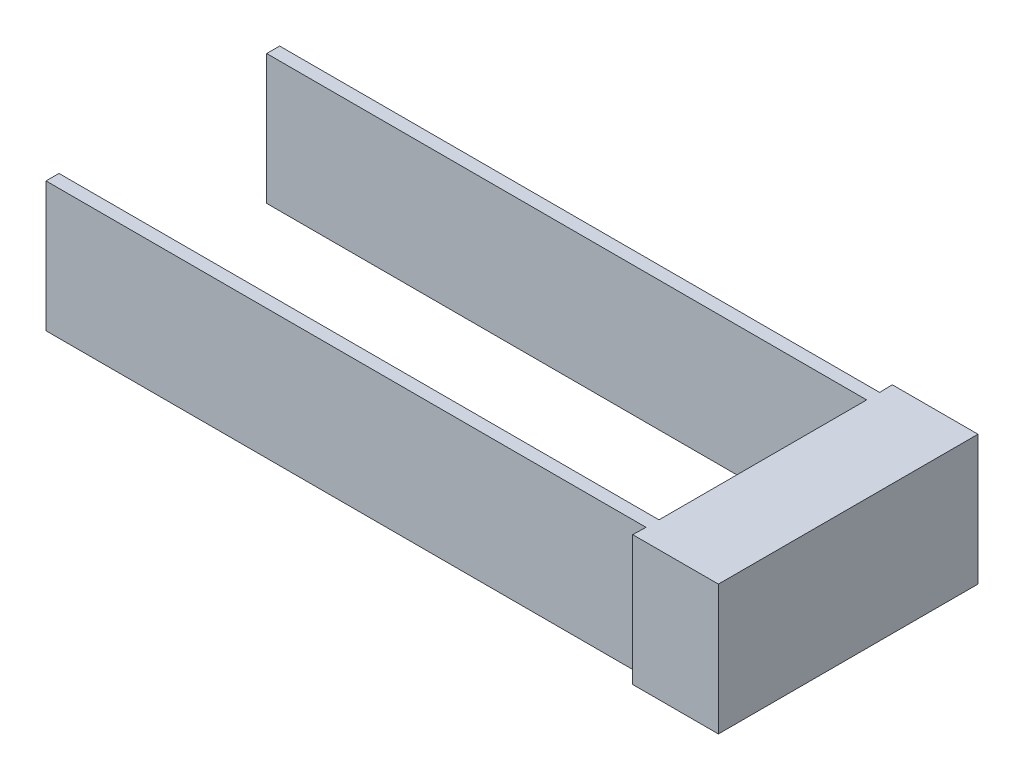
ISO-10303-21;
HEADER;
FILE_DESCRIPTION(('STEP AP214'),'2;1');
FILE_NAME('part.step','',(''),(''),'','','');
FILE_SCHEMA(('AUTOMOTIVE_DESIGN { 1 0 10303 214 1 1 1 1 }'));
ENDSEC;
DATA;
#1=APPLICATION_CONTEXT('core data for automotive mechanical design processes');
#2=APPLICATION_PROTOCOL_DEFINITION('international standard','automotive_design',2000,#1);
#3=PRODUCT_CONTEXT('',#1,'mechanical');
#4=PRODUCT('Part','Part','',(#3));
#5=PRODUCT_RELATED_PRODUCT_CATEGORY('part','',(#4));
#6=PRODUCT_DEFINITION_FORMATION('','',#4);
#7=PRODUCT_DEFINITION_CONTEXT('part definition',#1,'design');
#8=PRODUCT_DEFINITION('design','',#6,#7);
#9=PRODUCT_DEFINITION_SHAPE('','',#8);
#10=(LENGTH_UNIT() NAMED_UNIT(*) SI_UNIT(.MILLI.,.METRE.));
#11=(NAMED_UNIT(*) PLANE_ANGLE_UNIT() SI_UNIT($,.RADIAN.));
#12=(NAMED_UNIT(*) SI_UNIT($,.STERADIAN.) SOLID_ANGLE_UNIT());
#13=UNCERTAINTY_MEASURE_WITH_UNIT(LENGTH_MEASURE(1.E-05),#10,'distance_accuracy_value','');
#14=(GEOMETRIC_REPRESENTATION_CONTEXT(3) GLOBAL_UNCERTAINTY_ASSIGNED_CONTEXT((#13)) GLOBAL_UNIT_ASSIGNED_CONTEXT((#10,
#11,#12)) REPRESENTATION_CONTEXT('',''));
#15=CARTESIAN_POINT('',(0.,0.,0.));
#16=DIRECTION('',(0.,0.,1.));
#17=DIRECTION('',(1.,0.,0.));
#18=AXIS2_PLACEMENT_3D('',#15,#16,#17);
#19=CARTESIAN_POINT('',(-66.,25.,0.));
#20=DIRECTION('',(1.,0.,0.));
#21=DIRECTION('',(0.,0.,-1.));
#22=AXIS2_PLACEMENT_3D('',#19,#20,#21);
#23=PLANE('',#22);
#24=DIRECTION('',(0.,0.,1.));
#25=VECTOR('',#24,1.);
#26=CARTESIAN_POINT('',(-66.,0.,0.));
#27=LINE('',#26,#25);
#28=CARTESIAN_POINT('',(-66.,0.,-2.5));
#29=VERTEX_POINT('',#28);
#30=CARTESIAN_POINT('',(-66.,0.,0.));
#31=VERTEX_POINT('',#30);
#32=EDGE_CURVE('E157',#29,#31,#27,.T.);
#33=ORIENTED_EDGE('',*,*,#32,.T.);
#34=DIRECTION('',(0.,-1.,0.));
#35=VECTOR('',#34,1.);
#36=CARTESIAN_POINT('',(-66.,25.,0.));
#37=LINE('',#36,#35);
#38=CARTESIAN_POINT('',(-66.,25.,0.));
#39=VERTEX_POINT('',#38);
#40=EDGE_CURVE('E11',#39,#31,#37,.T.);
#41=ORIENTED_EDGE('',*,*,#40,.F.);
#42=DIRECTION('',(0.,0.,1.));
#43=VECTOR('',#42,1.);
#44=CARTESIAN_POINT('',(-66.,25.,0.));
#45=LINE('',#44,#43);
#46=CARTESIAN_POINT('',(-66.,25.,-2.5));
#47=VERTEX_POINT('',#46);
#48=EDGE_CURVE('E180',#47,#39,#45,.T.);
#49=ORIENTED_EDGE('',*,*,#48,.F.);
#50=DIRECTION('',(0.,-1.,0.));
#51=VECTOR('',#50,1.);
#52=CARTESIAN_POINT('',(-66.,25.,-2.5));
#53=LINE('',#52,#51);
#54=EDGE_CURVE('E153',#47,#29,#53,.T.);
#55=ORIENTED_EDGE('',*,*,#54,.T.);
#56=EDGE_LOOP('',(#33,#41,#49,#55));
#57=FACE_BOUND('',#56,.T.);
#58=ADVANCED_FACE('F37',(#57),#23,.F.);
#59=CARTESIAN_POINT('',(-66.,25.,0.));
#60=DIRECTION('',(0.,0.,-1.));
#61=DIRECTION('',(-1.,0.,0.));
#62=AXIS2_PLACEMENT_3D('',#59,#60,#61);
#63=PLANE('',#62);
#64=DIRECTION('',(1.,0.,0.));
#65=VECTOR('',#64,1.);
#66=CARTESIAN_POINT('',(-66.,0.,0.));
#67=LINE('',#66,#65);
#68=CARTESIAN_POINT('',(49.5583804790154,0.,0.));
#69=VERTEX_POINT('',#68);
#70=EDGE_CURVE('E160',#31,#69,#67,.T.);
#71=ORIENTED_EDGE('',*,*,#70,.T.);
#72=DIRECTION('',(0.,-1.,0.));
#73=VECTOR('',#72,1.);
#74=CARTESIAN_POINT('',(49.5583804790154,25.,0.));
#75=LINE('',#74,#73);
#76=CARTESIAN_POINT('',(49.5583804790154,25.,0.));
#77=VERTEX_POINT('',#76);
#78=EDGE_CURVE('E45',#77,#69,#75,.T.);
#79=ORIENTED_EDGE('',*,*,#78,.F.);
#80=DIRECTION('',(1.,0.,0.));
#81=VECTOR('',#80,1.);
#82=CARTESIAN_POINT('',(-66.,25.,0.));
#83=LINE('',#82,#81);
#84=EDGE_CURVE('E108',#39,#77,#83,.T.);
#85=ORIENTED_EDGE('',*,*,#84,.F.);
#86=ORIENTED_EDGE('',*,*,#40,.T.);
#87=EDGE_LOOP('',(#71,#79,#85,#86));
#88=FACE_BOUND('',#87,.T.);
#89=ADVANCED_FACE('F257',(#88),#63,.F.);
#90=CARTESIAN_POINT('',(49.5583804790154,25.,0.));
#91=DIRECTION('',(0.99972744904014,0.,0.0233458269439201));
#92=DIRECTION('',(0.0233458269439201,0.,-0.99972744904014));
#93=AXIS2_PLACEMENT_3D('',#90,#91,#92);
#94=PLANE('',#93);
#95=DIRECTION('',(-0.0233458269439201,0.,0.999727449040139));
#96=VECTOR('',#95,1.);
#97=CARTESIAN_POINT('',(49.5583804790154,0.,0.));
#98=LINE('',#97,#96);
#99=CARTESIAN_POINT('',(49.5,0.,2.5));
#100=VERTEX_POINT('',#99);
#101=EDGE_CURVE('E162',#69,#100,#98,.T.);
#102=ORIENTED_EDGE('',*,*,#101,.T.);
#103=DIRECTION('',(0.,-1.,0.));
#104=VECTOR('',#103,1.);
#105=CARTESIAN_POINT('',(49.5,25.,2.5));
#106=LINE('',#105,#104);
#107=CARTESIAN_POINT('',(49.5,25.,2.5));
#108=VERTEX_POINT('',#107);
#109=EDGE_CURVE('E199',#108,#100,#106,.T.);
#110=ORIENTED_EDGE('',*,*,#109,.F.);
#111=DIRECTION('',(-0.0233458269439201,0.,0.999727449040139));
#112=VECTOR('',#111,1.);
#113=CARTESIAN_POINT('',(49.5583804790154,25.,0.));
#114=LINE('',#113,#112);
#115=EDGE_CURVE('E207',#77,#108,#114,.T.);
#116=ORIENTED_EDGE('',*,*,#115,.F.);
#117=ORIENTED_EDGE('',*,*,#78,.T.);
#118=EDGE_LOOP('',(#102,#110,#116,#117));
#119=FACE_BOUND('',#118,.T.);
#120=ADVANCED_FACE('F205',(#119),#94,.F.);
#121=CARTESIAN_POINT('',(49.5,25.,2.5));
#122=DIRECTION('',(0.,0.,-1.));
#123=DIRECTION('',(-1.,0.,0.));
#124=AXIS2_PLACEMENT_3D('',#121,#122,#123);
#125=PLANE('',#124);
#126=DIRECTION('',(1.,0.,0.));
#127=VECTOR('',#126,1.);
#128=CARTESIAN_POINT('',(49.5,0.,2.5));
#129=LINE('',#128,#127);
#130=CARTESIAN_POINT('',(66.,0.,2.5));
#131=VERTEX_POINT('',#130);
#132=EDGE_CURVE('E164',#100,#131,#129,.T.);
#133=ORIENTED_EDGE('',*,*,#132,.T.);
#134=DIRECTION('',(0.,-1.,0.));
#135=VECTOR('',#134,1.);
#136=CARTESIAN_POINT('',(66.,25.,2.5));
#137=LINE('',#136,#135);
#138=CARTESIAN_POINT('',(66.,25.,2.5));
#139=VERTEX_POINT('',#138);
#140=EDGE_CURVE('E196',#139,#131,#137,.T.);
#141=ORIENTED_EDGE('',*,*,#140,.F.);
#142=DIRECTION('',(1.,0.,0.));
#143=VECTOR('',#142,1.);
#144=CARTESIAN_POINT('',(49.5,25.,2.5));
#145=LINE('',#144,#143);
#146=EDGE_CURVE('E224',#108,#139,#145,.T.);
#147=ORIENTED_EDGE('',*,*,#146,.F.);
#148=ORIENTED_EDGE('',*,*,#109,.T.);
#149=EDGE_LOOP('',(#133,#141,#147,#148));
#150=FACE_BOUND('',#149,.T.);
#151=ADVANCED_FACE('F215',(#150),#125,.F.);
#152=CARTESIAN_POINT('',(66.,25.,-45.));
#153=DIRECTION('',(-1.,0.,0.));
#154=DIRECTION('',(0.,0.,1.));
#155=AXIS2_PLACEMENT_3D('',#152,#153,#154);
#156=PLANE('',#155);
#157=DIRECTION('',(0.,0.,-1.));
#158=VECTOR('',#157,1.);
#159=CARTESIAN_POINT('',(66.,0.,-45.));
#160=LINE('',#159,#158);
#161=CARTESIAN_POINT('',(66.,0.,-47.5));
#162=VERTEX_POINT('',#161);
#163=EDGE_CURVE('E167',#131,#162,#160,.T.);
#164=ORIENTED_EDGE('',*,*,#163,.T.);
#165=DIRECTION('',(0.,-1.,0.));
#166=VECTOR('',#165,1.);
#167=CARTESIAN_POINT('',(66.,25.,-47.5));
#168=LINE('',#167,#166);
#169=CARTESIAN_POINT('',(66.,25.,-47.5));
#170=VERTEX_POINT('',#169);
#171=EDGE_CURVE('E193',#170,#162,#168,.T.);
#172=ORIENTED_EDGE('',*,*,#171,.F.);
#173=DIRECTION('',(0.,0.,-1.));
#174=VECTOR('',#173,1.);
#175=CARTESIAN_POINT('',(66.,25.,2.5));
#176=LINE('',#175,#174);
#177=EDGE_CURVE('E221',#139,#170,#176,.T.);
#178=ORIENTED_EDGE('',*,*,#177,.F.);
#179=ORIENTED_EDGE('',*,*,#140,.T.);
#180=EDGE_LOOP('',(#164,#172,#178,#179));
#181=FACE_BOUND('',#180,.T.);
#182=ADVANCED_FACE('F219',(#181),#156,.F.);
#183=CARTESIAN_POINT('',(66.,25.,-47.5));
#184=DIRECTION('',(0.,0.,1.));
#185=DIRECTION('',(1.,0.,0.));
#186=AXIS2_PLACEMENT_3D('',#183,#184,#185);
#187=PLANE('',#186);
#188=DIRECTION('',(-1.,0.,0.));
#189=VECTOR('',#188,1.);
#190=CARTESIAN_POINT('',(66.,0.,-47.5));
#191=LINE('',#190,#189);
#192=CARTESIAN_POINT('',(49.5,0.,-47.5));
#193=VERTEX_POINT('',#192);
#194=EDGE_CURVE('E169',#162,#193,#191,.T.);
#195=ORIENTED_EDGE('',*,*,#194,.T.);
#196=DIRECTION('',(0.,-1.,0.));
#197=VECTOR('',#196,1.);
#198=CARTESIAN_POINT('',(49.5,25.,-47.5));
#199=LINE('',#198,#197);
#200=CARTESIAN_POINT('',(49.5,25.,-47.5));
#201=VERTEX_POINT('',#200);
#202=EDGE_CURVE('E190',#201,#193,#199,.T.);
#203=ORIENTED_EDGE('',*,*,#202,.F.);
#204=DIRECTION('',(-1.,0.,0.));
#205=VECTOR('',#204,1.);
#206=CARTESIAN_POINT('',(66.,25.,-47.5));
#207=LINE('',#206,#205);
#208=EDGE_CURVE('E223',#170,#201,#207,.T.);
#209=ORIENTED_EDGE('',*,*,#208,.F.);
#210=ORIENTED_EDGE('',*,*,#171,.T.);
#211=EDGE_LOOP('',(#195,#203,#209,#210));
#212=FACE_BOUND('',#211,.T.);
#213=ADVANCED_FACE('F270',(#212),#187,.F.);
#214=CARTESIAN_POINT('',(49.5,25.,-47.5));
#215=DIRECTION('',(0.99972744904014,0.,-0.0233458269439147));
#216=DIRECTION('',(-0.0233458269439147,0.,-0.99972744904014));
#217=AXIS2_PLACEMENT_3D('',#214,#215,#216);
#218=PLANE('',#217);
#219=DIRECTION('',(0.0233458269439147,0.,0.999727449040139));
#220=VECTOR('',#219,1.);
#221=CARTESIAN_POINT('',(49.5,0.,-47.5));
#222=LINE('',#221,#220);
#223=CARTESIAN_POINT('',(49.5583804790154,0.,-45.));
#224=VERTEX_POINT('',#223);
#225=EDGE_CURVE('E171',#193,#224,#222,.T.);
#226=ORIENTED_EDGE('',*,*,#225,.T.);
#227=DIRECTION('',(0.,-1.,0.));
#228=VECTOR('',#227,1.);
#229=CARTESIAN_POINT('',(49.5583804790154,25.,-45.));
#230=LINE('',#229,#228);
#231=CARTESIAN_POINT('',(49.5583804790154,25.,-45.));
#232=VERTEX_POINT('',#231);
#233=EDGE_CURVE('E187',#232,#224,#230,.T.);
#234=ORIENTED_EDGE('',*,*,#233,.F.);
#235=DIRECTION('',(0.0233458269439147,0.,0.999727449040139));
#236=VECTOR('',#235,1.);
#237=CARTESIAN_POINT('',(49.5,25.,-47.5));
#238=LINE('',#237,#236);
#239=EDGE_CURVE('E226',#201,#232,#238,.T.);
#240=ORIENTED_EDGE('',*,*,#239,.F.);
#241=ORIENTED_EDGE('',*,*,#202,.T.);
#242=EDGE_LOOP('',(#226,#234,#240,#241));
#243=FACE_BOUND('',#242,.T.);
#244=ADVANCED_FACE('F273',(#243),#218,.F.);
#245=CARTESIAN_POINT('',(49.5583804790154,25.,-45.));
#246=DIRECTION('',(0.,0.,1.));
#247=DIRECTION('',(1.,0.,0.));
#248=AXIS2_PLACEMENT_3D('',#245,#246,#247);
#249=PLANE('',#248);
#250=DIRECTION('',(-1.,0.,0.));
#251=VECTOR('',#250,1.);
#252=CARTESIAN_POINT('',(49.5583804790154,0.,-45.));
#253=LINE('',#252,#251);
#254=CARTESIAN_POINT('',(-66.,0.,-45.));
#255=VERTEX_POINT('',#254);
#256=EDGE_CURVE('E173',#224,#255,#253,.T.);
#257=ORIENTED_EDGE('',*,*,#256,.T.);
#258=DIRECTION('',(0.,-1.,0.));
#259=VECTOR('',#258,1.);
#260=CARTESIAN_POINT('',(-66.,25.,-45.));
#261=LINE('',#260,#259);
#262=CARTESIAN_POINT('',(-66.,25.,-45.));
#263=VERTEX_POINT('',#262);
#264=EDGE_CURVE('E184',#263,#255,#261,.T.);
#265=ORIENTED_EDGE('',*,*,#264,.F.);
#266=DIRECTION('',(-1.,0.,0.));
#267=VECTOR('',#266,1.);
#268=CARTESIAN_POINT('',(49.5583804790154,25.,-45.));
#269=LINE('',#268,#267);
#270=EDGE_CURVE('E232',#232,#263,#269,.T.);
#271=ORIENTED_EDGE('',*,*,#270,.F.);
#272=ORIENTED_EDGE('',*,*,#233,.T.);
#273=EDGE_LOOP('',(#257,#265,#271,#272));
#274=FACE_BOUND('',#273,.T.);
#275=ADVANCED_FACE('F238',(#274),#249,.F.);
#276=CARTESIAN_POINT('',(-66.,25.,-42.5));
#277=DIRECTION('',(1.,0.,0.));
#278=DIRECTION('',(0.,0.,-1.));
#279=AXIS2_PLACEMENT_3D('',#276,#277,#278);
#280=PLANE('',#279);
#281=DIRECTION('',(0.,0.,1.));
#282=VECTOR('',#281,1.);
#283=CARTESIAN_POINT('',(-66.,0.,-42.5));
#284=LINE('',#283,#282);
#285=CARTESIAN_POINT('',(-66.,0.,-42.5));
#286=VERTEX_POINT('',#285);
#287=EDGE_CURVE('E175',#255,#286,#284,.T.);
#288=ORIENTED_EDGE('',*,*,#287,.T.);
#289=DIRECTION('',(0.,-1.,0.));
#290=VECTOR('',#289,1.);
#291=CARTESIAN_POINT('',(-66.,25.,-42.5));
#292=LINE('',#291,#290);
#293=CARTESIAN_POINT('',(-66.,25.,-42.5));
#294=VERTEX_POINT('',#293);
#295=EDGE_CURVE('E148',#294,#286,#292,.T.);
#296=ORIENTED_EDGE('',*,*,#295,.F.);
#297=DIRECTION('',(0.,0.,1.));
#298=VECTOR('',#297,1.);
#299=CARTESIAN_POINT('',(-66.,25.,-42.5));
#300=LINE('',#299,#298);
#301=EDGE_CURVE('E139',#263,#294,#300,.T.);
#302=ORIENTED_EDGE('',*,*,#301,.F.);
#303=ORIENTED_EDGE('',*,*,#264,.T.);
#304=EDGE_LOOP('',(#288,#296,#302,#303));
#305=FACE_BOUND('',#304,.T.);
#306=ADVANCED_FACE('F242',(#305),#280,.F.);
#307=CARTESIAN_POINT('',(49.5583804790154,25.,-42.5));
#308=DIRECTION('',(0.,0.,-1.));
#309=DIRECTION('',(-1.,0.,0.));
#310=AXIS2_PLACEMENT_3D('',#307,#308,#309);
#311=PLANE('',#310);
#312=DIRECTION('',(1.,0.,0.));
#313=VECTOR('',#312,1.);
#314=CARTESIAN_POINT('',(49.5583804790154,0.,-42.5));
#315=LINE('',#314,#313);
#316=CARTESIAN_POINT('',(49.5583804790154,0.,-42.5));
#317=VERTEX_POINT('',#316);
#318=EDGE_CURVE('E147',#286,#317,#315,.T.);
#319=ORIENTED_EDGE('',*,*,#318,.T.);
#320=DIRECTION('',(0.,-1.,0.));
#321=VECTOR('',#320,1.);
#322=CARTESIAN_POINT('',(49.5583804790154,25.,-42.5));
#323=LINE('',#322,#321);
#324=CARTESIAN_POINT('',(49.5583804790154,25.,-42.5));
#325=VERTEX_POINT('',#324);
#326=EDGE_CURVE('E144',#325,#317,#323,.T.);
#327=ORIENTED_EDGE('',*,*,#326,.F.);
#328=DIRECTION('',(1.,0.,0.));
#329=VECTOR('',#328,1.);
#330=CARTESIAN_POINT('',(49.5583804790154,25.,-42.5));
#331=LINE('',#330,#329);
#332=EDGE_CURVE('E133',#294,#325,#331,.T.);
#333=ORIENTED_EDGE('',*,*,#332,.F.);
#334=ORIENTED_EDGE('',*,*,#295,.T.);
#335=EDGE_LOOP('',(#319,#327,#333,#334));
#336=FACE_BOUND('',#335,.T.);
#337=ADVANCED_FACE('F145',(#336),#311,.F.);
#338=CARTESIAN_POINT('',(49.5583804790154,25.,-2.5));
#339=DIRECTION('',(1.,0.,0.));
#340=DIRECTION('',(0.,0.,-1.));
#341=AXIS2_PLACEMENT_3D('',#338,#339,#340);
#342=PLANE('',#341);
#343=DIRECTION('',(0.,0.,1.));
#344=VECTOR('',#343,1.);
#345=CARTESIAN_POINT('',(49.5583804790154,0.,-2.5));
#346=LINE('',#345,#344);
#347=CARTESIAN_POINT('',(49.5583804790154,0.,-2.5));
#348=VERTEX_POINT('',#347);
#349=EDGE_CURVE('E94',#317,#348,#346,.T.);
#350=ORIENTED_EDGE('',*,*,#349,.T.);
#351=DIRECTION('',(0.,-1.,0.));
#352=VECTOR('',#351,1.);
#353=CARTESIAN_POINT('',(49.5583804790154,25.,-2.5));
#354=LINE('',#353,#352);
#355=CARTESIAN_POINT('',(49.5583804790154,25.,-2.5));
#356=VERTEX_POINT('',#355);
#357=EDGE_CURVE('E149',#356,#348,#354,.T.);
#358=ORIENTED_EDGE('',*,*,#357,.F.);
#359=DIRECTION('',(0.,0.,1.));
#360=VECTOR('',#359,1.);
#361=CARTESIAN_POINT('',(49.5583804790154,25.,-2.5));
#362=LINE('',#361,#360);
#363=EDGE_CURVE('E137',#325,#356,#362,.T.);
#364=ORIENTED_EDGE('',*,*,#363,.F.);
#365=ORIENTED_EDGE('',*,*,#326,.T.);
#366=EDGE_LOOP('',(#350,#358,#364,#365));
#367=FACE_BOUND('',#366,.T.);
#368=ADVANCED_FACE('F151',(#367),#342,.F.);
#369=CARTESIAN_POINT('',(-66.,25.,-2.5));
#370=DIRECTION('',(0.,0.,1.));
#371=DIRECTION('',(1.,0.,0.));
#372=AXIS2_PLACEMENT_3D('',#369,#370,#371);
#373=PLANE('',#372);
#374=DIRECTION('',(-1.,0.,0.));
#375=VECTOR('',#374,1.);
#376=CARTESIAN_POINT('',(-66.,0.,-2.5));
#377=LINE('',#376,#375);
#378=EDGE_CURVE('E100',#348,#29,#377,.T.);
#379=ORIENTED_EDGE('',*,*,#378,.T.);
#380=ORIENTED_EDGE('',*,*,#54,.F.);
#381=DIRECTION('',(-1.,0.,0.));
#382=VECTOR('',#381,1.);
#383=CARTESIAN_POINT('',(-66.,25.,-2.5));
#384=LINE('',#383,#382);
#385=EDGE_CURVE('E53',#356,#47,#384,.T.);
#386=ORIENTED_EDGE('',*,*,#385,.F.);
#387=ORIENTED_EDGE('',*,*,#357,.T.);
#388=EDGE_LOOP('',(#379,#380,#386,#387));
#389=FACE_BOUND('',#388,.T.);
#390=ADVANCED_FACE('F246',(#389),#373,.F.);
#391=CARTESIAN_POINT('',(0.,25.,0.));
#392=DIRECTION('',(0.,-1.,0.));
#393=DIRECTION('',(0.,0.,-1.));
#394=AXIS2_PLACEMENT_3D('',#391,#392,#393);
#395=PLANE('',#394);
#396=ORIENTED_EDGE('',*,*,#48,.T.);
#397=ORIENTED_EDGE('',*,*,#84,.T.);
#398=ORIENTED_EDGE('',*,*,#115,.T.);
#399=ORIENTED_EDGE('',*,*,#146,.T.);
#400=ORIENTED_EDGE('',*,*,#177,.T.);
#401=ORIENTED_EDGE('',*,*,#208,.T.);
#402=ORIENTED_EDGE('',*,*,#239,.T.);
#403=ORIENTED_EDGE('',*,*,#270,.T.);
#404=ORIENTED_EDGE('',*,*,#301,.T.);
#405=ORIENTED_EDGE('',*,*,#332,.T.);
#406=ORIENTED_EDGE('',*,*,#363,.T.);
#407=ORIENTED_EDGE('',*,*,#385,.T.);
#408=EDGE_LOOP('',(#396,#397,#398,#399,#400,#401,#402,#403,#404,#405,#406,#407));
#409=FACE_BOUND('',#408,.T.);
#410=ADVANCED_FACE('F135',(#409),#395,.F.);
#411=CARTESIAN_POINT('',(0.,0.,0.));
#412=DIRECTION('',(0.,-1.,0.));
#413=DIRECTION('',(0.,0.,-1.));
#414=AXIS2_PLACEMENT_3D('',#411,#412,#413);
#415=PLANE('',#414);
#416=ORIENTED_EDGE('',*,*,#32,.F.);
#417=ORIENTED_EDGE('',*,*,#378,.F.);
#418=ORIENTED_EDGE('',*,*,#349,.F.);
#419=ORIENTED_EDGE('',*,*,#318,.F.);
#420=ORIENTED_EDGE('',*,*,#287,.F.);
#421=ORIENTED_EDGE('',*,*,#256,.F.);
#422=ORIENTED_EDGE('',*,*,#225,.F.);
#423=ORIENTED_EDGE('',*,*,#194,.F.);
#424=ORIENTED_EDGE('',*,*,#163,.F.);
#425=ORIENTED_EDGE('',*,*,#132,.F.);
#426=ORIENTED_EDGE('',*,*,#101,.F.);
#427=ORIENTED_EDGE('',*,*,#70,.F.);
#428=EDGE_LOOP('',(#416,#417,#418,#419,#420,#421,#422,#423,#424,#425,#426,#427));
#429=FACE_BOUND('',#428,.T.);
#430=ADVANCED_FACE('F211',(#429),#415,.T.);
#431=CLOSED_SHELL('',(#58,#89,#120,#151,#182,#213,#244,#275,#306,#337,#368,#390,#410,#430));
#432=MANIFOLD_SOLID_BREP('B2',#431);
#433=ADVANCED_BREP_SHAPE_REPRESENTATION('',(#18,#432),#14);
#434=SHAPE_DEFINITION_REPRESENTATION(#9,#433);
ENDSEC;
END-ISO-10303-21;
